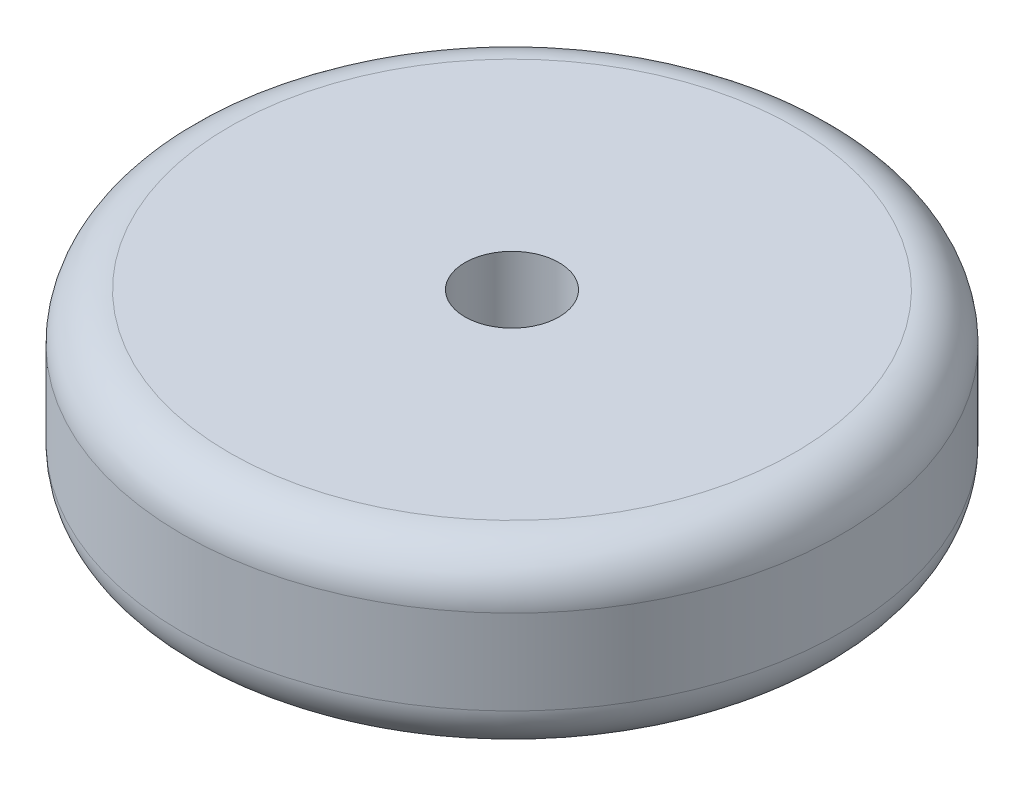
ISO-10303-21;
HEADER;
FILE_DESCRIPTION(('STEP AP214'),'2;1');
FILE_NAME('part.step','',(''),(''),'','','');
FILE_SCHEMA(('AUTOMOTIVE_DESIGN { 1 0 10303 214 1 1 1 1 }'));
ENDSEC;
DATA;
#1=APPLICATION_CONTEXT('core data for automotive mechanical design processes');
#2=APPLICATION_PROTOCOL_DEFINITION('international standard','automotive_design',2000,#1);
#3=PRODUCT_CONTEXT('',#1,'mechanical');
#4=PRODUCT('Part','Part','',(#3));
#5=PRODUCT_RELATED_PRODUCT_CATEGORY('part','',(#4));
#6=PRODUCT_DEFINITION_FORMATION('','',#4);
#7=PRODUCT_DEFINITION_CONTEXT('part definition',#1,'design');
#8=PRODUCT_DEFINITION('design','',#6,#7);
#9=PRODUCT_DEFINITION_SHAPE('','',#8);
#10=(LENGTH_UNIT() NAMED_UNIT(*) SI_UNIT(.MILLI.,.METRE.));
#11=(NAMED_UNIT(*) PLANE_ANGLE_UNIT() SI_UNIT($,.RADIAN.));
#12=(NAMED_UNIT(*) SI_UNIT($,.STERADIAN.) SOLID_ANGLE_UNIT());
#13=UNCERTAINTY_MEASURE_WITH_UNIT(LENGTH_MEASURE(1.E-05),#10,'distance_accuracy_value','');
#14=(GEOMETRIC_REPRESENTATION_CONTEXT(3) GLOBAL_UNCERTAINTY_ASSIGNED_CONTEXT((#13)) GLOBAL_UNIT_ASSIGNED_CONTEXT((#10,
#11,#12)) REPRESENTATION_CONTEXT('',''));
#15=CARTESIAN_POINT('',(0.,0.,0.));
#16=DIRECTION('',(0.,0.,1.));
#17=DIRECTION('',(1.,0.,0.));
#18=AXIS2_PLACEMENT_3D('',#15,#16,#17);
#19=CARTESIAN_POINT('',(0.,1.9,0.));
#20=DIRECTION('',(0.,-1.,0.));
#21=DIRECTION('',(0.,0.,-1.));
#22=AXIS2_PLACEMENT_3D('',#19,#20,#21);
#23=CYLINDRICAL_SURFACE('',#22,3.5);
#24=CARTESIAN_POINT('',(0.,1.4,0.));
#25=DIRECTION('',(0.,1.,0.));
#26=DIRECTION('',(0.,0.,1.));
#27=AXIS2_PLACEMENT_3D('',#24,#25,#26);
#28=CIRCLE('',#27,3.5);
#29=CARTESIAN_POINT('',(0.,1.4,-3.5));
#30=VERTEX_POINT('',#29);
#31=EDGE_CURVE('E40',#30,#30,#28,.F.);
#32=CARTESIAN_POINT('',(0.,0.5,0.));
#33=DIRECTION('',(0.,1.,0.));
#34=DIRECTION('',(0.,0.,1.));
#35=AXIS2_PLACEMENT_3D('',#32,#33,#34);
#36=CIRCLE('',#35,3.5);
#37=CARTESIAN_POINT('',(0.,0.5,-3.5));
#38=VERTEX_POINT('',#37);
#39=EDGE_CURVE('E44',#38,#38,#36,.T.);
#40=CARTESIAN_POINT('',(0.,1.4,-3.5));
#41=CARTESIAN_POINT('',(0.,1.390625,-3.5));
#42=CARTESIAN_POINT('',(0.,1.38125,-3.5));
#43=CARTESIAN_POINT('',(0.,1.3625,-3.5));
#44=CARTESIAN_POINT('',(0.,1.353125,-3.5));
#45=CARTESIAN_POINT('',(0.,1.334375,-3.5));
#46=CARTESIAN_POINT('',(0.,1.325,-3.5));
#47=CARTESIAN_POINT('',(0.,1.30625,-3.5));
#48=CARTESIAN_POINT('',(0.,1.296875,-3.5));
#49=CARTESIAN_POINT('',(0.,1.278125,-3.5));
#50=CARTESIAN_POINT('',(0.,1.26875,-3.5));
#51=CARTESIAN_POINT('',(0.,1.25,-3.5));
#52=CARTESIAN_POINT('',(0.,1.240625,-3.5));
#53=CARTESIAN_POINT('',(0.,1.221875,-3.5));
#54=CARTESIAN_POINT('',(0.,1.2125,-3.5));
#55=CARTESIAN_POINT('',(0.,1.19375,-3.5));
#56=CARTESIAN_POINT('',(0.,1.184375,-3.5));
#57=CARTESIAN_POINT('',(0.,1.165625,-3.5));
#58=CARTESIAN_POINT('',(0.,1.15625,-3.5));
#59=CARTESIAN_POINT('',(0.,1.1375,-3.5));
#60=CARTESIAN_POINT('',(0.,1.128125,-3.5));
#61=CARTESIAN_POINT('',(0.,1.109375,-3.5));
#62=CARTESIAN_POINT('',(0.,1.1,-3.5));
#63=CARTESIAN_POINT('',(0.,1.08125,-3.5));
#64=CARTESIAN_POINT('',(0.,1.071875,-3.5));
#65=CARTESIAN_POINT('',(0.,1.053125,-3.5));
#66=CARTESIAN_POINT('',(0.,1.04375,-3.5));
#67=CARTESIAN_POINT('',(0.,1.025,-3.5));
#68=CARTESIAN_POINT('',(0.,1.015625,-3.5));
#69=CARTESIAN_POINT('',(0.,0.996875,-3.5));
#70=CARTESIAN_POINT('',(0.,0.9875,-3.5));
#71=CARTESIAN_POINT('',(0.,0.96875,-3.5));
#72=CARTESIAN_POINT('',(0.,0.959375,-3.5));
#73=CARTESIAN_POINT('',(0.,0.940625,-3.5));
#74=CARTESIAN_POINT('',(0.,0.93125,-3.5));
#75=CARTESIAN_POINT('',(0.,0.9125,-3.5));
#76=CARTESIAN_POINT('',(0.,0.903125,-3.5));
#77=CARTESIAN_POINT('',(0.,0.884375,-3.5));
#78=CARTESIAN_POINT('',(0.,0.875,-3.5));
#79=CARTESIAN_POINT('',(0.,0.85625,-3.5));
#80=CARTESIAN_POINT('',(0.,0.846875,-3.5));
#81=CARTESIAN_POINT('',(0.,0.828125,-3.5));
#82=CARTESIAN_POINT('',(0.,0.81875,-3.5));
#83=CARTESIAN_POINT('',(0.,0.8,-3.5));
#84=CARTESIAN_POINT('',(0.,0.790625,-3.5));
#85=CARTESIAN_POINT('',(0.,0.771875,-3.5));
#86=CARTESIAN_POINT('',(0.,0.7625,-3.5));
#87=CARTESIAN_POINT('',(0.,0.74375,-3.5));
#88=CARTESIAN_POINT('',(0.,0.734375,-3.5));
#89=CARTESIAN_POINT('',(0.,0.715625,-3.5));
#90=CARTESIAN_POINT('',(0.,0.70625,-3.5));
#91=CARTESIAN_POINT('',(0.,0.6875,-3.5));
#92=CARTESIAN_POINT('',(0.,0.678125,-3.5));
#93=CARTESIAN_POINT('',(0.,0.659375,-3.5));
#94=CARTESIAN_POINT('',(0.,0.65,-3.5));
#95=CARTESIAN_POINT('',(0.,0.63125,-3.5));
#96=CARTESIAN_POINT('',(0.,0.621875,-3.5));
#97=CARTESIAN_POINT('',(0.,0.603125,-3.5));
#98=CARTESIAN_POINT('',(0.,0.59375,-3.5));
#99=CARTESIAN_POINT('',(0.,0.575,-3.5));
#100=CARTESIAN_POINT('',(0.,0.565624999999999,-3.5));
#101=CARTESIAN_POINT('',(0.,0.546875,-3.5));
#102=CARTESIAN_POINT('',(0.,0.537499999999999,-3.5));
#103=CARTESIAN_POINT('',(0.,0.51875,-3.5));
#104=CARTESIAN_POINT('',(0.,0.509374999999999,-3.5));
#105=CARTESIAN_POINT('',(0.,0.5,-3.5));
#106=B_SPLINE_CURVE_WITH_KNOTS('',3,(#40,#41,#42,#43,#44,#45,#46,#47,#48,#49,#50,#51,#52,#53,
#54,#55,#56,#57,#58,#59,#60,#61,#62,#63,#64,#65,#66,#67,#68,#69,#70,#71,#72,#73,#74,#75,#76,#77,
#78,#79,#80,#81,#82,#83,#84,#85,#86,#87,#88,#89,#90,#91,#92,#93,#94,#95,#96,#97,#98,#99,#100,
#101,#102,#103,#104,#105),.UNSPECIFIED.,.F.,.F.,(4,2,2,2,2,2,2,2,2,2,2,2,2,2,2,2,2,2,2,2,2,2,2,
2,2,2,2,2,2,2,2,2,4),(0.,0.0281249999999999,0.0562499999999999,0.0843749999999998,0.1125,
0.140625,0.16875,0.196875,0.225,0.253125,0.28125,0.309375,0.3375,0.365625,0.39375,0.421875,0.45,
0.478125,0.50625,0.534375,0.5625,0.590625,0.61875,0.646875,0.675,0.703125,0.73125,0.759375,
0.7875,0.815625,0.84375,0.871875,0.9),.UNSPECIFIED.);
#107=EDGE_CURVE('BSEAM33',#30,#38,#106,.T.);
#108=ORIENTED_EDGE('',*,*,#31,.T.);
#109=ORIENTED_EDGE('',*,*,#39,.T.);
#110=ORIENTED_EDGE('',*,*,#107,.T.);
#111=ORIENTED_EDGE('',*,*,#107,.F.);
#112=EDGE_LOOP('',(#108,#110,#109,#111));
#113=FACE_BOUND('',#112,.T.);
#114=ADVANCED_FACE('F33',(#113),#23,.T.);
#115=CARTESIAN_POINT('',(0.,1.9,0.));
#116=DIRECTION('',(0.,1.,0.));
#117=DIRECTION('',(0.,0.,1.));
#118=AXIS2_PLACEMENT_3D('',#115,#116,#117);
#119=PLANE('',#118);
#120=CARTESIAN_POINT('',(0.,1.9,0.));
#121=DIRECTION('',(0.,1.,0.));
#122=DIRECTION('',(0.,0.,1.));
#123=AXIS2_PLACEMENT_3D('',#120,#121,#122);
#124=CIRCLE('',#123,3.);
#125=CARTESIAN_POINT('',(0.,1.9,3.));
#126=VERTEX_POINT('',#125);
#127=EDGE_CURVE('E48',#126,#126,#124,.T.);
#128=ORIENTED_EDGE('',*,*,#127,.T.);
#129=EDGE_LOOP('',(#128));
#130=FACE_BOUND('',#129,.T.);
#131=CARTESIAN_POINT('',(0.,1.9,0.));
#132=DIRECTION('',(0.,1.,0.));
#133=DIRECTION('',(0.,0.,1.));
#134=AXIS2_PLACEMENT_3D('',#131,#132,#133);
#135=CIRCLE('',#134,0.5);
#136=CARTESIAN_POINT('',(0.,1.9,0.5));
#137=VERTEX_POINT('',#136);
#138=EDGE_CURVE('E54',#137,#137,#135,.T.);
#139=ORIENTED_EDGE('',*,*,#138,.F.);
#140=EDGE_LOOP('',(#139));
#141=FACE_BOUND('',#140,.T.);
#142=ADVANCED_FACE('F69',(#130,#141),#119,.T.);
#143=CARTESIAN_POINT('',(0.,0.,0.));
#144=DIRECTION('',(0.,1.,0.));
#145=DIRECTION('',(0.,0.,1.));
#146=AXIS2_PLACEMENT_3D('',#143,#144,#145);
#147=PLANE('',#146);
#148=CARTESIAN_POINT('',(0.,0.,0.));
#149=DIRECTION('',(0.,1.,0.));
#150=DIRECTION('',(0.,0.,1.));
#151=AXIS2_PLACEMENT_3D('',#148,#149,#150);
#152=CIRCLE('',#151,3.);
#153=CARTESIAN_POINT('',(0.,0.,3.));
#154=VERTEX_POINT('',#153);
#155=EDGE_CURVE('E10',#154,#154,#152,.F.);
#156=ORIENTED_EDGE('',*,*,#155,.T.);
#157=EDGE_LOOP('',(#156));
#158=FACE_BOUND('',#157,.T.);
#159=CARTESIAN_POINT('',(0.,0.,0.));
#160=DIRECTION('',(0.,1.,0.));
#161=DIRECTION('',(0.,0.,1.));
#162=AXIS2_PLACEMENT_3D('',#159,#160,#161);
#163=CIRCLE('',#162,0.5);
#164=CARTESIAN_POINT('',(0.,0.,0.5));
#165=VERTEX_POINT('',#164);
#166=EDGE_CURVE('E53',#165,#165,#163,.T.);
#167=ORIENTED_EDGE('',*,*,#166,.T.);
#168=EDGE_LOOP('',(#167));
#169=FACE_BOUND('',#168,.T.);
#170=ADVANCED_FACE('F60',(#158,#169),#147,.F.);
#171=CARTESIAN_POINT('',(0.,0.,0.));
#172=DIRECTION('',(0.,1.,0.));
#173=DIRECTION('',(0.,0.,1.));
#174=AXIS2_PLACEMENT_3D('',#171,#172,#173);
#175=CYLINDRICAL_SURFACE('',#174,0.5);
#176=ORIENTED_EDGE('',*,*,#166,.F.);
#177=EDGE_LOOP('',(#176));
#178=FACE_BOUND('',#177,.T.);
#179=ORIENTED_EDGE('',*,*,#138,.T.);
#180=EDGE_LOOP('',(#179));
#181=FACE_BOUND('',#180,.T.);
#182=ADVANCED_FACE('F62',(#178,#181),#175,.F.);
#183=CARTESIAN_POINT('',(0.,1.4,0.));
#184=DIRECTION('',(0.,1.,0.));
#185=DIRECTION('',(0.,0.,1.));
#186=AXIS2_PLACEMENT_3D('',#183,#184,#185);
#187=TOROIDAL_SURFACE('',#186,3.,0.5);
#188=ORIENTED_EDGE('',*,*,#31,.F.);
#189=EDGE_LOOP('',(#188));
#190=FACE_BOUND('',#189,.T.);
#191=ORIENTED_EDGE('',*,*,#127,.F.);
#192=EDGE_LOOP('',(#191));
#193=FACE_BOUND('',#192,.T.);
#194=ADVANCED_FACE('F65',(#190,#193),#187,.T.);
#195=CARTESIAN_POINT('',(0.,0.5,0.));
#196=DIRECTION('',(0.,1.,0.));
#197=DIRECTION('',(0.,0.,1.));
#198=AXIS2_PLACEMENT_3D('',#195,#196,#197);
#199=TOROIDAL_SURFACE('',#198,3.,0.5);
#200=ORIENTED_EDGE('',*,*,#155,.F.);
#201=EDGE_LOOP('',(#200));
#202=FACE_BOUND('',#201,.T.);
#203=ORIENTED_EDGE('',*,*,#39,.F.);
#204=EDGE_LOOP('',(#203));
#205=FACE_BOUND('',#204,.T.);
#206=ADVANCED_FACE('F35',(#202,#205),#199,.T.);
#207=CLOSED_SHELL('',(#114,#142,#170,#182,#194,#206));
#208=MANIFOLD_SOLID_BREP('B2',#207);
#209=ADVANCED_BREP_SHAPE_REPRESENTATION('',(#18,#208),#14);
#210=SHAPE_DEFINITION_REPRESENTATION(#9,#209);
ENDSEC;
END-ISO-10303-21;
